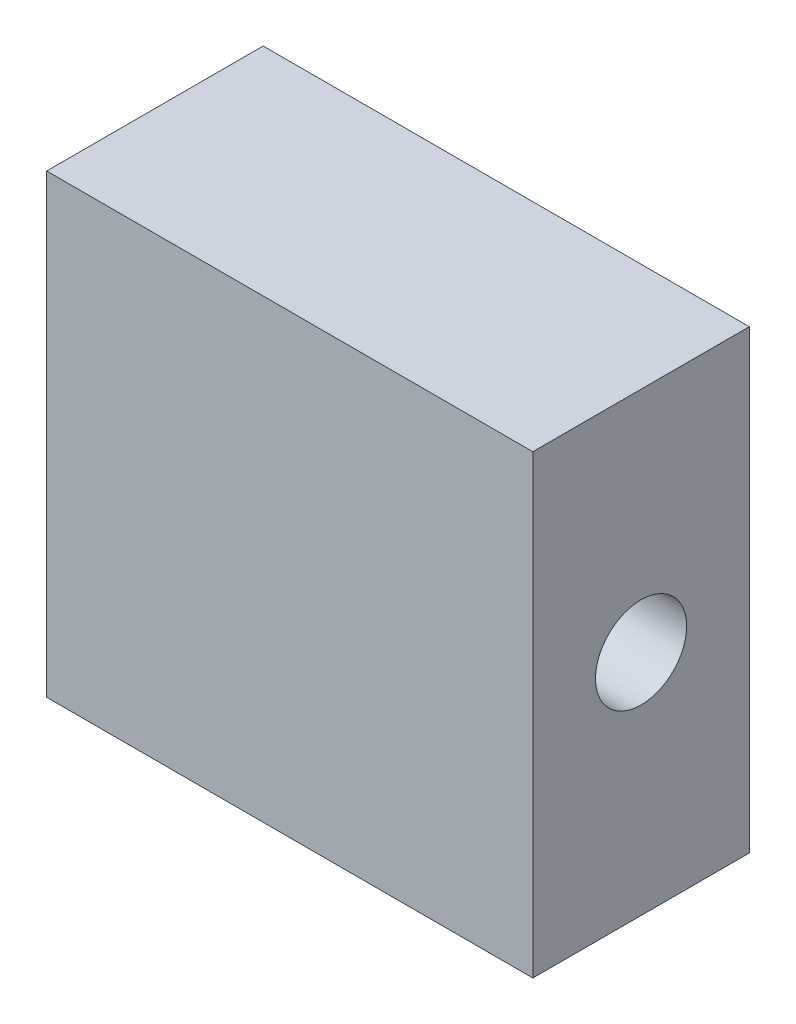
ISO-10303-21;
HEADER;
FILE_DESCRIPTION(('STEP AP214'),'2;1');
FILE_NAME('part.step','',(''),(''),'','','');
FILE_SCHEMA(('AUTOMOTIVE_DESIGN { 1 0 10303 214 1 1 1 1 }'));
ENDSEC;
DATA;
#1=APPLICATION_CONTEXT('core data for automotive mechanical design processes');
#2=APPLICATION_PROTOCOL_DEFINITION('international standard','automotive_design',2000,#1);
#3=PRODUCT_CONTEXT('',#1,'mechanical');
#4=PRODUCT('Part','Part','',(#3));
#5=PRODUCT_RELATED_PRODUCT_CATEGORY('part','',(#4));
#6=PRODUCT_DEFINITION_FORMATION('','',#4);
#7=PRODUCT_DEFINITION_CONTEXT('part definition',#1,'design');
#8=PRODUCT_DEFINITION('design','',#6,#7);
#9=PRODUCT_DEFINITION_SHAPE('','',#8);
#10=(LENGTH_UNIT() NAMED_UNIT(*) SI_UNIT(.MILLI.,.METRE.));
#11=(NAMED_UNIT(*) PLANE_ANGLE_UNIT() SI_UNIT($,.RADIAN.));
#12=(NAMED_UNIT(*) SI_UNIT($,.STERADIAN.) SOLID_ANGLE_UNIT());
#13=UNCERTAINTY_MEASURE_WITH_UNIT(LENGTH_MEASURE(1.E-05),#10,'distance_accuracy_value','');
#14=(GEOMETRIC_REPRESENTATION_CONTEXT(3) GLOBAL_UNCERTAINTY_ASSIGNED_CONTEXT((#13)) GLOBAL_UNIT_ASSIGNED_CONTEXT((#10,
#11,#12)) REPRESENTATION_CONTEXT('',''));
#15=CARTESIAN_POINT('',(0.,0.,0.));
#16=DIRECTION('',(0.,0.,1.));
#17=DIRECTION('',(1.,0.,0.));
#18=AXIS2_PLACEMENT_3D('',#15,#16,#17);
#19=CARTESIAN_POINT('',(16.,-15.,7.125));
#20=DIRECTION('',(-1.,0.,0.));
#21=DIRECTION('',(0.,0.,1.));
#22=AXIS2_PLACEMENT_3D('',#19,#20,#21);
#23=PLANE('',#22);
#24=CARTESIAN_POINT('',(16.,0.,0.));
#25=DIRECTION('',(1.,0.,0.));
#26=DIRECTION('',(0.,0.,-1.));
#27=AXIS2_PLACEMENT_3D('',#24,#25,#26);
#28=CIRCLE('',#27,2.99999999999999);
#29=CARTESIAN_POINT('',(16.,0.,-2.99999999999999));
#30=VERTEX_POINT('',#29);
#31=EDGE_CURVE('E198',#30,#30,#28,.T.);
#32=ORIENTED_EDGE('',*,*,#31,.F.);
#33=EDGE_LOOP('',(#32));
#34=FACE_BOUND('',#33,.T.);
#35=DIRECTION('',(0.,1.,0.));
#36=VECTOR('',#35,1.);
#37=CARTESIAN_POINT('',(16.,-15.,-7.125));
#38=LINE('',#37,#36);
#39=CARTESIAN_POINT('',(16.,-15.,-7.125));
#40=VERTEX_POINT('',#39);
#41=CARTESIAN_POINT('',(16.,15.,-7.125));
#42=VERTEX_POINT('',#41);
#43=EDGE_CURVE('E143',#40,#42,#38,.T.);
#44=ORIENTED_EDGE('',*,*,#43,.T.);
#45=DIRECTION('',(0.,0.,-1.));
#46=VECTOR('',#45,1.);
#47=CARTESIAN_POINT('',(16.,15.,7.125));
#48=LINE('',#47,#46);
#49=CARTESIAN_POINT('',(16.,15.,7.125));
#50=VERTEX_POINT('',#49);
#51=EDGE_CURVE('E11',#50,#42,#48,.T.);
#52=ORIENTED_EDGE('',*,*,#51,.F.);
#53=DIRECTION('',(0.,1.,0.));
#54=VECTOR('',#53,1.);
#55=CARTESIAN_POINT('',(16.,-15.,7.125));
#56=LINE('',#55,#54);
#57=CARTESIAN_POINT('',(16.,-15.,7.125));
#58=VERTEX_POINT('',#57);
#59=EDGE_CURVE('E144',#58,#50,#56,.T.);
#60=ORIENTED_EDGE('',*,*,#59,.F.);
#61=DIRECTION('',(0.,0.,-1.));
#62=VECTOR('',#61,1.);
#63=CARTESIAN_POINT('',(16.,-15.,7.125));
#64=LINE('',#63,#62);
#65=EDGE_CURVE('E154',#58,#40,#64,.T.);
#66=ORIENTED_EDGE('',*,*,#65,.T.);
#67=EDGE_LOOP('',(#44,#52,#60,#66));
#68=FACE_BOUND('',#67,.T.);
#69=ADVANCED_FACE('F39',(#34,#68),#23,.F.);
#70=CARTESIAN_POINT('',(-16.,15.,7.125));
#71=DIRECTION('',(0.,-1.,0.));
#72=DIRECTION('',(0.,0.,-1.));
#73=AXIS2_PLACEMENT_3D('',#70,#71,#72);
#74=PLANE('',#73);
#75=DIRECTION('',(-1.,0.,0.));
#76=VECTOR('',#75,1.);
#77=CARTESIAN_POINT('',(-16.,15.,-7.125));
#78=LINE('',#77,#76);
#79=CARTESIAN_POINT('',(-16.,15.,-7.125));
#80=VERTEX_POINT('',#79);
#81=EDGE_CURVE('E158',#42,#80,#78,.T.);
#82=ORIENTED_EDGE('',*,*,#81,.T.);
#83=DIRECTION('',(0.,0.,-1.));
#84=VECTOR('',#83,1.);
#85=CARTESIAN_POINT('',(-16.,15.,7.125));
#86=LINE('',#85,#84);
#87=CARTESIAN_POINT('',(-16.,15.,7.125));
#88=VERTEX_POINT('',#87);
#89=EDGE_CURVE('E48',#88,#80,#86,.T.);
#90=ORIENTED_EDGE('',*,*,#89,.F.);
#91=DIRECTION('',(-1.,0.,0.));
#92=VECTOR('',#91,1.);
#93=CARTESIAN_POINT('',(-16.,15.,7.125));
#94=LINE('',#93,#92);
#95=EDGE_CURVE('E87',#50,#88,#94,.T.);
#96=ORIENTED_EDGE('',*,*,#95,.F.);
#97=ORIENTED_EDGE('',*,*,#51,.T.);
#98=EDGE_LOOP('',(#82,#90,#96,#97));
#99=FACE_BOUND('',#98,.T.);
#100=ADVANCED_FACE('F187',(#99),#74,.F.);
#101=CARTESIAN_POINT('',(-16.,-15.,7.125));
#102=DIRECTION('',(1.,0.,0.));
#103=DIRECTION('',(0.,0.,-1.));
#104=AXIS2_PLACEMENT_3D('',#101,#102,#103);
#105=PLANE('',#104);
#106=CARTESIAN_POINT('',(-16.,0.,0.));
#107=DIRECTION('',(1.,0.,0.));
#108=DIRECTION('',(0.,0.,-1.));
#109=AXIS2_PLACEMENT_3D('',#106,#107,#108);
#110=CIRCLE('',#109,2.99999999999998);
#111=CARTESIAN_POINT('',(-16.,0.,-2.99999999999998));
#112=VERTEX_POINT('',#111);
#113=EDGE_CURVE('E120',#112,#112,#110,.T.);
#114=ORIENTED_EDGE('',*,*,#113,.T.);
#115=EDGE_LOOP('',(#114));
#116=FACE_BOUND('',#115,.T.);
#117=DIRECTION('',(0.,-1.,0.));
#118=VECTOR('',#117,1.);
#119=CARTESIAN_POINT('',(-16.,-15.,-7.125));
#120=LINE('',#119,#118);
#121=CARTESIAN_POINT('',(-16.,-15.,-7.125));
#122=VERTEX_POINT('',#121);
#123=EDGE_CURVE('E74',#80,#122,#120,.T.);
#124=ORIENTED_EDGE('',*,*,#123,.T.);
#125=DIRECTION('',(0.,0.,-1.));
#126=VECTOR('',#125,1.);
#127=CARTESIAN_POINT('',(-16.,-15.,7.125));
#128=LINE('',#127,#126);
#129=CARTESIAN_POINT('',(-16.,-15.,7.125));
#130=VERTEX_POINT('',#129);
#131=EDGE_CURVE('E167',#130,#122,#128,.T.);
#132=ORIENTED_EDGE('',*,*,#131,.F.);
#133=DIRECTION('',(0.,-1.,0.));
#134=VECTOR('',#133,1.);
#135=CARTESIAN_POINT('',(-16.,-15.,7.125));
#136=LINE('',#135,#134);
#137=EDGE_CURVE('E149',#88,#130,#136,.T.);
#138=ORIENTED_EDGE('',*,*,#137,.F.);
#139=ORIENTED_EDGE('',*,*,#89,.T.);
#140=EDGE_LOOP('',(#124,#132,#138,#139));
#141=FACE_BOUND('',#140,.T.);
#142=ADVANCED_FACE('F171',(#116,#141),#105,.F.);
#143=CARTESIAN_POINT('',(-16.,-15.,7.125));
#144=DIRECTION('',(0.,1.,0.));
#145=DIRECTION('',(0.,0.,1.));
#146=AXIS2_PLACEMENT_3D('',#143,#144,#145);
#147=PLANE('',#146);
#148=DIRECTION('',(1.,0.,0.));
#149=VECTOR('',#148,1.);
#150=CARTESIAN_POINT('',(-16.,-15.,-7.125));
#151=LINE('',#150,#149);
#152=EDGE_CURVE('E80',#122,#40,#151,.T.);
#153=ORIENTED_EDGE('',*,*,#152,.T.);
#154=ORIENTED_EDGE('',*,*,#65,.F.);
#155=DIRECTION('',(1.,0.,0.));
#156=VECTOR('',#155,1.);
#157=CARTESIAN_POINT('',(-16.,-15.,7.125));
#158=LINE('',#157,#156);
#159=EDGE_CURVE('E56',#130,#58,#158,.T.);
#160=ORIENTED_EDGE('',*,*,#159,.F.);
#161=ORIENTED_EDGE('',*,*,#131,.T.);
#162=EDGE_LOOP('',(#153,#154,#160,#161));
#163=FACE_BOUND('',#162,.T.);
#164=ADVANCED_FACE('F178',(#163),#147,.F.);
#165=CARTESIAN_POINT('',(0.,0.,7.125));
#166=DIRECTION('',(0.,0.,-1.));
#167=DIRECTION('',(-1.,0.,0.));
#168=AXIS2_PLACEMENT_3D('',#165,#166,#167);
#169=PLANE('',#168);
#170=ORIENTED_EDGE('',*,*,#59,.T.);
#171=ORIENTED_EDGE('',*,*,#95,.T.);
#172=ORIENTED_EDGE('',*,*,#137,.T.);
#173=ORIENTED_EDGE('',*,*,#159,.T.);
#174=EDGE_LOOP('',(#170,#171,#172,#173));
#175=FACE_BOUND('',#174,.T.);
#176=ADVANCED_FACE('F180',(#175),#169,.F.);
#177=CARTESIAN_POINT('',(0.,0.,-7.125));
#178=DIRECTION('',(0.,0.,-1.));
#179=DIRECTION('',(-1.,0.,0.));
#180=AXIS2_PLACEMENT_3D('',#177,#178,#179);
#181=PLANE('',#180);
#182=CARTESIAN_POINT('',(9.33333333333333,10.,-7.125));
#183=DIRECTION('',(0.,0.,-1.));
#184=DIRECTION('',(-1.,0.,0.));
#185=AXIS2_PLACEMENT_3D('',#182,#183,#184);
#186=CIRCLE('',#185,1.24999999999999);
#187=CARTESIAN_POINT('',(8.08333333333334,10.,-7.125));
#188=VERTEX_POINT('',#187);
#189=EDGE_CURVE('E112',#188,#188,#186,.T.);
#190=ORIENTED_EDGE('',*,*,#189,.F.);
#191=EDGE_LOOP('',(#190));
#192=FACE_BOUND('',#191,.T.);
#193=CARTESIAN_POINT('',(-10.6666666666667,10.,-7.125));
#194=DIRECTION('',(0.,0.,-1.));
#195=DIRECTION('',(-1.,0.,0.));
#196=AXIS2_PLACEMENT_3D('',#193,#194,#195);
#197=CIRCLE('',#196,1.24999999999999);
#198=CARTESIAN_POINT('',(-11.9166666666667,10.,-7.125));
#199=VERTEX_POINT('',#198);
#200=EDGE_CURVE('E111',#199,#199,#197,.T.);
#201=ORIENTED_EDGE('',*,*,#200,.F.);
#202=EDGE_LOOP('',(#201));
#203=FACE_BOUND('',#202,.T.);
#204=CARTESIAN_POINT('',(-10.6666666666667,-10.,-7.125));
#205=DIRECTION('',(0.,0.,-1.));
#206=DIRECTION('',(-1.,0.,0.));
#207=AXIS2_PLACEMENT_3D('',#204,#205,#206);
#208=CIRCLE('',#207,1.24999999999999);
#209=CARTESIAN_POINT('',(-11.9166666666667,-10.,-7.125));
#210=VERTEX_POINT('',#209);
#211=EDGE_CURVE('E127',#210,#210,#208,.T.);
#212=ORIENTED_EDGE('',*,*,#211,.F.);
#213=EDGE_LOOP('',(#212));
#214=FACE_BOUND('',#213,.T.);
#215=CARTESIAN_POINT('',(9.33333333333333,-10.,-7.125));
#216=DIRECTION('',(0.,0.,-1.));
#217=DIRECTION('',(-1.,0.,0.));
#218=AXIS2_PLACEMENT_3D('',#215,#216,#217);
#219=CIRCLE('',#218,1.24999999999999);
#220=CARTESIAN_POINT('',(8.08333333333334,-10.,-7.125));
#221=VERTEX_POINT('',#220);
#222=EDGE_CURVE('E135',#221,#221,#219,.T.);
#223=ORIENTED_EDGE('',*,*,#222,.F.);
#224=EDGE_LOOP('',(#223));
#225=FACE_BOUND('',#224,.T.);
#226=ORIENTED_EDGE('',*,*,#43,.F.);
#227=ORIENTED_EDGE('',*,*,#152,.F.);
#228=ORIENTED_EDGE('',*,*,#123,.F.);
#229=ORIENTED_EDGE('',*,*,#81,.F.);
#230=EDGE_LOOP('',(#226,#227,#228,#229));
#231=FACE_BOUND('',#230,.T.);
#232=ADVANCED_FACE('F174',(#192,#203,#214,#225,#231),#181,.T.);
#233=CARTESIAN_POINT('',(9.33333333333333,-10.,0.374999999999999));
#234=DIRECTION('',(0.,0.,-1.));
#235=DIRECTION('',(-1.,0.,0.));
#236=AXIS2_PLACEMENT_3D('',#233,#234,#235);
#237=CONICAL_SURFACE('',#236,1.25,1.02974425867665);
#238=CARTESIAN_POINT('',(9.33333333333333,-10.,1.12607577378445));
#239=VERTEX_POINT('',#238);
#240=VERTEX_LOOP('',#239);
#241=FACE_BOUND('',#240,.T.);
#242=CARTESIAN_POINT('',(9.33333333333333,-10.,0.374999999999999));
#243=DIRECTION('',(0.,0.,-1.));
#244=DIRECTION('',(-1.,0.,0.));
#245=AXIS2_PLACEMENT_3D('',#242,#243,#244);
#246=CIRCLE('',#245,1.25);
#247=CARTESIAN_POINT('',(8.08333333333334,-10.,0.374999999999999));
#248=VERTEX_POINT('',#247);
#249=EDGE_CURVE('E139',#248,#248,#246,.T.);
#250=ORIENTED_EDGE('',*,*,#249,.T.);
#251=EDGE_LOOP('',(#250));
#252=FACE_BOUND('',#251,.T.);
#253=ADVANCED_FACE('F232',(#241,#252),#237,.F.);
#254=CARTESIAN_POINT('',(9.33333333333333,-10.,-7.125));
#255=DIRECTION('',(0.,0.,-1.));
#256=DIRECTION('',(-1.,0.,0.));
#257=AXIS2_PLACEMENT_3D('',#254,#255,#256);
#258=CYLINDRICAL_SURFACE('',#257,1.24999999999999);
#259=ORIENTED_EDGE('',*,*,#249,.F.);
#260=EDGE_LOOP('',(#259));
#261=FACE_BOUND('',#260,.T.);
#262=ORIENTED_EDGE('',*,*,#222,.T.);
#263=EDGE_LOOP('',(#262));
#264=FACE_BOUND('',#263,.T.);
#265=ADVANCED_FACE('F228',(#261,#264),#258,.F.);
#266=CARTESIAN_POINT('',(-10.6666666666667,-10.,0.374999999999999));
#267=DIRECTION('',(0.,0.,-1.));
#268=DIRECTION('',(-1.,0.,0.));
#269=AXIS2_PLACEMENT_3D('',#266,#267,#268);
#270=CONICAL_SURFACE('',#269,1.25,1.02974425867665);
#271=CARTESIAN_POINT('',(-10.6666666666667,-10.,1.12607577378445));
#272=VERTEX_POINT('',#271);
#273=VERTEX_LOOP('',#272);
#274=FACE_BOUND('',#273,.T.);
#275=CARTESIAN_POINT('',(-10.6666666666667,-10.,0.374999999999999));
#276=DIRECTION('',(0.,0.,-1.));
#277=DIRECTION('',(-1.,0.,0.));
#278=AXIS2_PLACEMENT_3D('',#275,#276,#277);
#279=CIRCLE('',#278,1.25);
#280=CARTESIAN_POINT('',(-11.9166666666667,-10.,0.374999999999999));
#281=VERTEX_POINT('',#280);
#282=EDGE_CURVE('E131',#281,#281,#279,.T.);
#283=ORIENTED_EDGE('',*,*,#282,.T.);
#284=EDGE_LOOP('',(#283));
#285=FACE_BOUND('',#284,.T.);
#286=ADVANCED_FACE('F224',(#274,#285),#270,.F.);
#287=CARTESIAN_POINT('',(-10.6666666666667,-10.,-7.125));
#288=DIRECTION('',(0.,0.,-1.));
#289=DIRECTION('',(-1.,0.,0.));
#290=AXIS2_PLACEMENT_3D('',#287,#288,#289);
#291=CYLINDRICAL_SURFACE('',#290,1.24999999999999);
#292=ORIENTED_EDGE('',*,*,#282,.F.);
#293=EDGE_LOOP('',(#292));
#294=FACE_BOUND('',#293,.T.);
#295=ORIENTED_EDGE('',*,*,#211,.T.);
#296=EDGE_LOOP('',(#295));
#297=FACE_BOUND('',#296,.T.);
#298=ADVANCED_FACE('F220',(#294,#297),#291,.F.);
#299=CARTESIAN_POINT('',(-10.6666666666667,10.,0.374999999999999));
#300=DIRECTION('',(0.,0.,-1.));
#301=DIRECTION('',(-1.,0.,0.));
#302=AXIS2_PLACEMENT_3D('',#299,#300,#301);
#303=CONICAL_SURFACE('',#302,1.25,1.02974425867665);
#304=CARTESIAN_POINT('',(-10.6666666666667,10.,1.12607577378445));
#305=VERTEX_POINT('',#304);
#306=VERTEX_LOOP('',#305);
#307=FACE_BOUND('',#306,.T.);
#308=CARTESIAN_POINT('',(-10.6666666666667,10.,0.374999999999999));
#309=DIRECTION('',(0.,0.,-1.));
#310=DIRECTION('',(-1.,0.,0.));
#311=AXIS2_PLACEMENT_3D('',#308,#309,#310);
#312=CIRCLE('',#311,1.25);
#313=CARTESIAN_POINT('',(-11.9166666666667,10.,0.374999999999999));
#314=VERTEX_POINT('',#313);
#315=EDGE_CURVE('E117',#314,#314,#312,.T.);
#316=ORIENTED_EDGE('',*,*,#315,.T.);
#317=EDGE_LOOP('',(#316));
#318=FACE_BOUND('',#317,.T.);
#319=ADVANCED_FACE('F216',(#307,#318),#303,.F.);
#320=CARTESIAN_POINT('',(-10.6666666666667,10.,-7.125));
#321=DIRECTION('',(0.,0.,-1.));
#322=DIRECTION('',(-1.,0.,0.));
#323=AXIS2_PLACEMENT_3D('',#320,#321,#322);
#324=CYLINDRICAL_SURFACE('',#323,1.24999999999999);
#325=ORIENTED_EDGE('',*,*,#315,.F.);
#326=EDGE_LOOP('',(#325));
#327=FACE_BOUND('',#326,.T.);
#328=ORIENTED_EDGE('',*,*,#200,.T.);
#329=EDGE_LOOP('',(#328));
#330=FACE_BOUND('',#329,.T.);
#331=ADVANCED_FACE('F104',(#327,#330),#324,.F.);
#332=CARTESIAN_POINT('',(9.33333333333333,10.,0.374999999999999));
#333=DIRECTION('',(0.,0.,-1.));
#334=DIRECTION('',(-1.,0.,0.));
#335=AXIS2_PLACEMENT_3D('',#332,#333,#334);
#336=CONICAL_SURFACE('',#335,1.25,1.02974425867665);
#337=CARTESIAN_POINT('',(9.33333333333333,10.,1.12607577378445));
#338=VERTEX_POINT('',#337);
#339=VERTEX_LOOP('',#338);
#340=FACE_BOUND('',#339,.T.);
#341=CARTESIAN_POINT('',(9.33333333333333,10.,0.374999999999999));
#342=DIRECTION('',(0.,0.,-1.));
#343=DIRECTION('',(-1.,0.,0.));
#344=AXIS2_PLACEMENT_3D('',#341,#342,#343);
#345=CIRCLE('',#344,1.25);
#346=CARTESIAN_POINT('',(8.08333333333333,10.,0.374999999999999));
#347=VERTEX_POINT('',#346);
#348=EDGE_CURVE('E108',#347,#347,#345,.T.);
#349=ORIENTED_EDGE('',*,*,#348,.T.);
#350=EDGE_LOOP('',(#349));
#351=FACE_BOUND('',#350,.T.);
#352=ADVANCED_FACE('F100',(#340,#351),#336,.F.);
#353=CARTESIAN_POINT('',(9.33333333333333,10.,-7.125));
#354=DIRECTION('',(0.,0.,-1.));
#355=DIRECTION('',(-1.,0.,0.));
#356=AXIS2_PLACEMENT_3D('',#353,#354,#355);
#357=CYLINDRICAL_SURFACE('',#356,1.24999999999999);
#358=ORIENTED_EDGE('',*,*,#348,.F.);
#359=EDGE_LOOP('',(#358));
#360=FACE_BOUND('',#359,.T.);
#361=ORIENTED_EDGE('',*,*,#189,.T.);
#362=EDGE_LOOP('',(#361));
#363=FACE_BOUND('',#362,.T.);
#364=ADVANCED_FACE('F103',(#360,#363),#357,.F.);
#365=CARTESIAN_POINT('',(16.,0.,0.));
#366=DIRECTION('',(1.,0.,0.));
#367=DIRECTION('',(0.,0.,-1.));
#368=AXIS2_PLACEMENT_3D('',#365,#366,#367);
#369=CYLINDRICAL_SURFACE('',#368,2.99999999999999);
#370=ORIENTED_EDGE('',*,*,#113,.F.);
#371=EDGE_LOOP('',(#370));
#372=FACE_BOUND('',#371,.T.);
#373=ORIENTED_EDGE('',*,*,#31,.T.);
#374=EDGE_LOOP('',(#373));
#375=FACE_BOUND('',#374,.T.);
#376=ADVANCED_FACE('F206',(#372,#375),#369,.F.);
#377=CLOSED_SHELL('',(#69,#100,#142,#164,#176,#232,#253,#265,#286,#298,#319,#331,#352,#364,#376));
#378=MANIFOLD_SOLID_BREP('B2',#377);
#379=ADVANCED_BREP_SHAPE_REPRESENTATION('',(#18,#378),#14);
#380=SHAPE_DEFINITION_REPRESENTATION(#9,#379);
ENDSEC;
END-ISO-10303-21;
